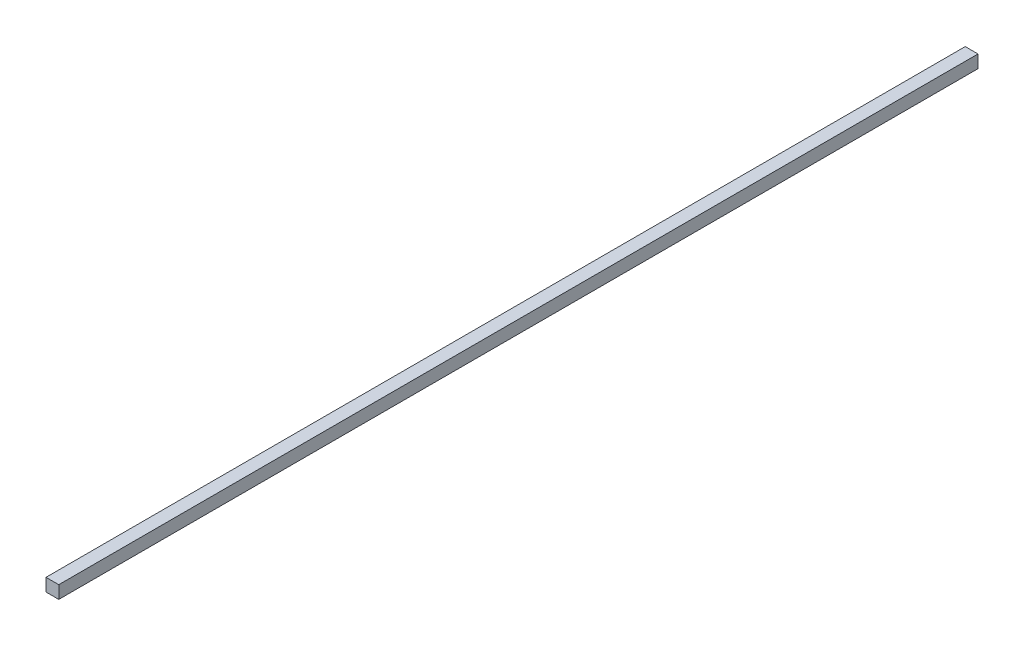
ISO-10303-21;
HEADER;
FILE_DESCRIPTION(('STEP AP214'),'2;1');
FILE_NAME('part.step','',(''),(''),'','','');
FILE_SCHEMA(('AUTOMOTIVE_DESIGN { 1 0 10303 214 1 1 1 1 }'));
ENDSEC;
DATA;
#1=APPLICATION_CONTEXT('core data for automotive mechanical design processes');
#2=APPLICATION_PROTOCOL_DEFINITION('international standard','automotive_design',2000,#1);
#3=PRODUCT_CONTEXT('',#1,'mechanical');
#4=PRODUCT('Part','Part','',(#3));
#5=PRODUCT_RELATED_PRODUCT_CATEGORY('part','',(#4));
#6=PRODUCT_DEFINITION_FORMATION('','',#4);
#7=PRODUCT_DEFINITION_CONTEXT('part definition',#1,'design');
#8=PRODUCT_DEFINITION('design','',#6,#7);
#9=PRODUCT_DEFINITION_SHAPE('','',#8);
#10=(LENGTH_UNIT() NAMED_UNIT(*) SI_UNIT(.MILLI.,.METRE.));
#11=(NAMED_UNIT(*) PLANE_ANGLE_UNIT() SI_UNIT($,.RADIAN.));
#12=(NAMED_UNIT(*) SI_UNIT($,.STERADIAN.) SOLID_ANGLE_UNIT());
#13=UNCERTAINTY_MEASURE_WITH_UNIT(LENGTH_MEASURE(1.E-05),#10,'distance_accuracy_value','');
#14=(GEOMETRIC_REPRESENTATION_CONTEXT(3) GLOBAL_UNCERTAINTY_ASSIGNED_CONTEXT((#13)) GLOBAL_UNIT_ASSIGNED_CONTEXT((#10,
#11,#12)) REPRESENTATION_CONTEXT('',''));
#15=CARTESIAN_POINT('',(0.,0.,0.));
#16=DIRECTION('',(0.,0.,1.));
#17=DIRECTION('',(1.,0.,0.));
#18=AXIS2_PLACEMENT_3D('',#15,#16,#17);
#19=CARTESIAN_POINT('',(0.,0.,1828.8));
#20=DIRECTION('',(-1.,0.,0.));
#21=DIRECTION('',(0.,-1.,0.));
#22=AXIS2_PLACEMENT_3D('',#19,#20,#21);
#23=PLANE('',#22);
#24=DIRECTION('',(0.,1.,0.));
#25=VECTOR('',#24,1.);
#26=CARTESIAN_POINT('',(0.,0.,0.));
#27=LINE('',#26,#25);
#28=CARTESIAN_POINT('',(0.,0.,0.));
#29=VERTEX_POINT('',#28);
#30=CARTESIAN_POINT('',(0.,25.4,0.));
#31=VERTEX_POINT('',#30);
#32=EDGE_CURVE('E110',#29,#31,#27,.T.);
#33=ORIENTED_EDGE('',*,*,#32,.F.);
#34=DIRECTION('',(0.,0.,-1.));
#35=VECTOR('',#34,1.);
#36=CARTESIAN_POINT('',(0.,0.,1828.8));
#37=LINE('',#36,#35);
#38=CARTESIAN_POINT('',(0.,0.,1828.8));
#39=VERTEX_POINT('',#38);
#40=EDGE_CURVE('E11',#39,#29,#37,.T.);
#41=ORIENTED_EDGE('',*,*,#40,.F.);
#42=DIRECTION('',(0.,1.,0.));
#43=VECTOR('',#42,1.);
#44=CARTESIAN_POINT('',(0.,0.,1828.8));
#45=LINE('',#44,#43);
#46=CARTESIAN_POINT('',(0.,25.4,1828.8));
#47=VERTEX_POINT('',#46);
#48=EDGE_CURVE('E103',#39,#47,#45,.T.);
#49=ORIENTED_EDGE('',*,*,#48,.T.);
#50=DIRECTION('',(0.,0.,-1.));
#51=VECTOR('',#50,1.);
#52=CARTESIAN_POINT('',(0.,25.4,1828.8));
#53=LINE('',#52,#51);
#54=EDGE_CURVE('E42',#47,#31,#53,.T.);
#55=ORIENTED_EDGE('',*,*,#54,.T.);
#56=EDGE_LOOP('',(#33,#41,#49,#55));
#57=FACE_BOUND('',#56,.T.);
#58=ADVANCED_FACE('F39',(#57),#23,.T.);
#59=CARTESIAN_POINT('',(0.,0.,1828.8));
#60=DIRECTION('',(0.,1.,0.));
#61=DIRECTION('',(0.,0.,1.));
#62=AXIS2_PLACEMENT_3D('',#59,#60,#61);
#63=PLANE('',#62);
#64=DIRECTION('',(1.,0.,0.));
#65=VECTOR('',#64,1.);
#66=CARTESIAN_POINT('',(0.,0.,0.));
#67=LINE('',#66,#65);
#68=CARTESIAN_POINT('',(25.4,0.,0.));
#69=VERTEX_POINT('',#68);
#70=EDGE_CURVE('E73',#29,#69,#67,.T.);
#71=ORIENTED_EDGE('',*,*,#70,.T.);
#72=DIRECTION('',(0.,0.,-1.));
#73=VECTOR('',#72,1.);
#74=CARTESIAN_POINT('',(25.4,0.,1828.8));
#75=LINE('',#74,#73);
#76=CARTESIAN_POINT('',(25.4,0.,1828.8));
#77=VERTEX_POINT('',#76);
#78=EDGE_CURVE('E49',#77,#69,#75,.T.);
#79=ORIENTED_EDGE('',*,*,#78,.F.);
#80=DIRECTION('',(1.,0.,0.));
#81=VECTOR('',#80,1.);
#82=CARTESIAN_POINT('',(0.,0.,1828.8));
#83=LINE('',#82,#81);
#84=EDGE_CURVE('E90',#39,#77,#83,.T.);
#85=ORIENTED_EDGE('',*,*,#84,.F.);
#86=ORIENTED_EDGE('',*,*,#40,.T.);
#87=EDGE_LOOP('',(#71,#79,#85,#86));
#88=FACE_BOUND('',#87,.T.);
#89=ADVANCED_FACE('F126',(#88),#63,.F.);
#90=CARTESIAN_POINT('',(25.4,0.,1828.8));
#91=DIRECTION('',(-1.,0.,0.));
#92=DIRECTION('',(0.,-1.,0.));
#93=AXIS2_PLACEMENT_3D('',#90,#91,#92);
#94=PLANE('',#93);
#95=DIRECTION('',(0.,1.,0.));
#96=VECTOR('',#95,1.);
#97=CARTESIAN_POINT('',(25.4,0.,0.));
#98=LINE('',#97,#96);
#99=CARTESIAN_POINT('',(25.4,25.4,0.));
#100=VERTEX_POINT('',#99);
#101=EDGE_CURVE('E98',#69,#100,#98,.T.);
#102=ORIENTED_EDGE('',*,*,#101,.T.);
#103=DIRECTION('',(0.,0.,-1.));
#104=VECTOR('',#103,1.);
#105=CARTESIAN_POINT('',(25.4,25.4,1828.8));
#106=LINE('',#105,#104);
#107=CARTESIAN_POINT('',(25.4,25.4,1828.8));
#108=VERTEX_POINT('',#107);
#109=EDGE_CURVE('E95',#108,#100,#106,.T.);
#110=ORIENTED_EDGE('',*,*,#109,.F.);
#111=DIRECTION('',(0.,1.,0.));
#112=VECTOR('',#111,1.);
#113=CARTESIAN_POINT('',(25.4,0.,1828.8));
#114=LINE('',#113,#112);
#115=EDGE_CURVE('E85',#77,#108,#114,.T.);
#116=ORIENTED_EDGE('',*,*,#115,.F.);
#117=ORIENTED_EDGE('',*,*,#78,.T.);
#118=EDGE_LOOP('',(#102,#110,#116,#117));
#119=FACE_BOUND('',#118,.T.);
#120=ADVANCED_FACE('F96',(#119),#94,.F.);
#121=CARTESIAN_POINT('',(0.,25.4,1828.8));
#122=DIRECTION('',(0.,1.,0.));
#123=DIRECTION('',(0.,0.,1.));
#124=AXIS2_PLACEMENT_3D('',#121,#122,#123);
#125=PLANE('',#124);
#126=DIRECTION('',(1.,0.,0.));
#127=VECTOR('',#126,1.);
#128=CARTESIAN_POINT('',(0.,25.4,0.));
#129=LINE('',#128,#127);
#130=EDGE_CURVE('E114',#31,#100,#129,.T.);
#131=ORIENTED_EDGE('',*,*,#130,.F.);
#132=ORIENTED_EDGE('',*,*,#54,.F.);
#133=DIRECTION('',(1.,0.,0.));
#134=VECTOR('',#133,1.);
#135=CARTESIAN_POINT('',(0.,25.4,1828.8));
#136=LINE('',#135,#134);
#137=EDGE_CURVE('E89',#47,#108,#136,.T.);
#138=ORIENTED_EDGE('',*,*,#137,.T.);
#139=ORIENTED_EDGE('',*,*,#109,.T.);
#140=EDGE_LOOP('',(#131,#132,#138,#139));
#141=FACE_BOUND('',#140,.T.);
#142=ADVANCED_FACE('F101',(#141),#125,.T.);
#143=CARTESIAN_POINT('',(0.,0.,1828.8));
#144=DIRECTION('',(0.,0.,-1.));
#145=DIRECTION('',(-1.,0.,0.));
#146=AXIS2_PLACEMENT_3D('',#143,#144,#145);
#147=PLANE('',#146);
#148=ORIENTED_EDGE('',*,*,#48,.F.);
#149=ORIENTED_EDGE('',*,*,#84,.T.);
#150=ORIENTED_EDGE('',*,*,#115,.T.);
#151=ORIENTED_EDGE('',*,*,#137,.F.);
#152=EDGE_LOOP('',(#148,#149,#150,#151));
#153=FACE_BOUND('',#152,.T.);
#154=ADVANCED_FACE('F88',(#153),#147,.F.);
#155=CARTESIAN_POINT('',(0.,0.,0.));
#156=DIRECTION('',(0.,0.,-1.));
#157=DIRECTION('',(-1.,0.,0.));
#158=AXIS2_PLACEMENT_3D('',#155,#156,#157);
#159=PLANE('',#158);
#160=ORIENTED_EDGE('',*,*,#32,.T.);
#161=ORIENTED_EDGE('',*,*,#130,.T.);
#162=ORIENTED_EDGE('',*,*,#101,.F.);
#163=ORIENTED_EDGE('',*,*,#70,.F.);
#164=EDGE_LOOP('',(#160,#161,#162,#163));
#165=FACE_BOUND('',#164,.T.);
#166=ADVANCED_FACE('F123',(#165),#159,.T.);
#167=CLOSED_SHELL('',(#58,#89,#120,#142,#154,#166));
#168=MANIFOLD_SOLID_BREP('B2',#167);
#169=ADVANCED_BREP_SHAPE_REPRESENTATION('',(#18,#168),#14);
#170=SHAPE_DEFINITION_REPRESENTATION(#9,#169);
ENDSEC;
END-ISO-10303-21;
